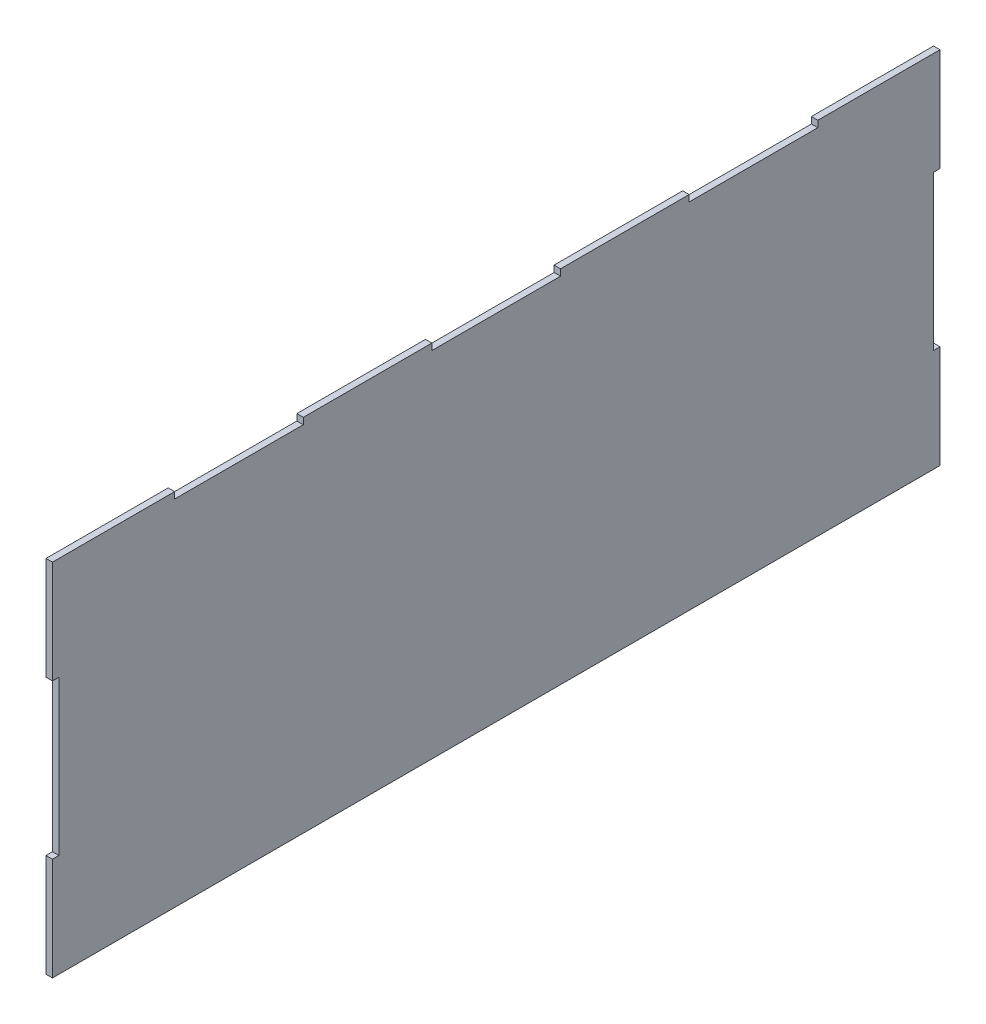
ISO-10303-21;
HEADER;
FILE_DESCRIPTION(('STEP AP214'),'2;1');
FILE_NAME('part.step','',(''),(''),'','','');
FILE_SCHEMA(('AUTOMOTIVE_DESIGN { 1 0 10303 214 1 1 1 1 }'));
ENDSEC;
DATA;
#1=APPLICATION_CONTEXT('core data for automotive mechanical design processes');
#2=APPLICATION_PROTOCOL_DEFINITION('international standard','automotive_design',2000,#1);
#3=PRODUCT_CONTEXT('',#1,'mechanical');
#4=PRODUCT('Part','Part','',(#3));
#5=PRODUCT_RELATED_PRODUCT_CATEGORY('part','',(#4));
#6=PRODUCT_DEFINITION_FORMATION('','',#4);
#7=PRODUCT_DEFINITION_CONTEXT('part definition',#1,'design');
#8=PRODUCT_DEFINITION('design','',#6,#7);
#9=PRODUCT_DEFINITION_SHAPE('','',#8);
#10=(LENGTH_UNIT() NAMED_UNIT(*) SI_UNIT(.MILLI.,.METRE.));
#11=(NAMED_UNIT(*) PLANE_ANGLE_UNIT() SI_UNIT($,.RADIAN.));
#12=(NAMED_UNIT(*) SI_UNIT($,.STERADIAN.) SOLID_ANGLE_UNIT());
#13=UNCERTAINTY_MEASURE_WITH_UNIT(LENGTH_MEASURE(1.E-05),#10,'distance_accuracy_value','');
#14=(GEOMETRIC_REPRESENTATION_CONTEXT(3) GLOBAL_UNCERTAINTY_ASSIGNED_CONTEXT((#13)) GLOBAL_UNIT_ASSIGNED_CONTEXT((#10,
#11,#12)) REPRESENTATION_CONTEXT('',''));
#15=CARTESIAN_POINT('',(0.,0.,0.));
#16=DIRECTION('',(0.,0.,1.));
#17=DIRECTION('',(1.,0.,0.));
#18=AXIS2_PLACEMENT_3D('',#15,#16,#17);
#19=CARTESIAN_POINT('',(5.,140.,340.));
#20=DIRECTION('',(0.,-1.,0.));
#21=DIRECTION('',(0.,0.,-1.));
#22=AXIS2_PLACEMENT_3D('',#19,#20,#21);
#23=PLANE('',#22);
#24=DIRECTION('',(0.,0.,1.));
#25=VECTOR('',#24,1.);
#26=CARTESIAN_POINT('',(5.,140.,340.));
#27=LINE('',#26,#25);
#28=CARTESIAN_POINT('',(5.,140.,-150.));
#29=VERTEX_POINT('',#28);
#30=CARTESIAN_POINT('',(5.,140.,-50.));
#31=VERTEX_POINT('',#30);
#32=EDGE_CURVE('E368',#29,#31,#27,.T.);
#33=ORIENTED_EDGE('',*,*,#32,.F.);
#34=DIRECTION('',(1.,0.,0.));
#35=VECTOR('',#34,1.);
#36=CARTESIAN_POINT('',(0.,140.,-150.));
#37=LINE('',#36,#35);
#38=CARTESIAN_POINT('',(0.,140.,-150.));
#39=VERTEX_POINT('',#38);
#40=EDGE_CURVE('E233',#39,#29,#37,.T.);
#41=ORIENTED_EDGE('',*,*,#40,.F.);
#42=DIRECTION('',(0.,0.,1.));
#43=VECTOR('',#42,1.);
#44=CARTESIAN_POINT('',(0.,140.,340.));
#45=LINE('',#44,#43);
#46=CARTESIAN_POINT('',(0.,140.,-50.));
#47=VERTEX_POINT('',#46);
#48=EDGE_CURVE('E223',#39,#47,#45,.T.);
#49=ORIENTED_EDGE('',*,*,#48,.T.);
#50=DIRECTION('',(1.,0.,0.));
#51=VECTOR('',#50,1.);
#52=CARTESIAN_POINT('',(0.,140.,-50.));
#53=LINE('',#52,#51);
#54=EDGE_CURVE('E283',#47,#31,#53,.T.);
#55=ORIENTED_EDGE('',*,*,#54,.T.);
#56=EDGE_LOOP('',(#33,#41,#49,#55));
#57=FACE_BOUND('',#56,.T.);
#58=ADVANCED_FACE('F39',(#57),#23,.F.);
#59=CARTESIAN_POINT('',(5.,140.,250.));
#60=VERTEX_POINT('',#59);
#61=CARTESIAN_POINT('',(5.,140.,345.));
#62=VERTEX_POINT('',#61);
#63=EDGE_CURVE('E364',#60,#62,#27,.T.);
#64=ORIENTED_EDGE('',*,*,#63,.F.);
#65=DIRECTION('',(1.,0.,0.));
#66=VECTOR('',#65,1.);
#67=CARTESIAN_POINT('',(0.,140.,250.));
#68=LINE('',#67,#66);
#69=CARTESIAN_POINT('',(0.,140.,250.));
#70=VERTEX_POINT('',#69);
#71=EDGE_CURVE('E259',#70,#60,#68,.T.);
#72=ORIENTED_EDGE('',*,*,#71,.F.);
#73=CARTESIAN_POINT('',(0.,140.,345.));
#74=VERTEX_POINT('',#73);
#75=EDGE_CURVE('E372',#70,#74,#45,.T.);
#76=ORIENTED_EDGE('',*,*,#75,.T.);
#77=DIRECTION('',(1.,0.,0.));
#78=VECTOR('',#77,1.);
#79=CARTESIAN_POINT('',(-80.156097709407,140.,345.));
#80=LINE('',#79,#78);
#81=EDGE_CURVE('E354',#74,#62,#80,.T.);
#82=ORIENTED_EDGE('',*,*,#81,.T.);
#83=EDGE_LOOP('',(#64,#72,#76,#82));
#84=FACE_BOUND('',#83,.T.);
#85=ADVANCED_FACE('F416',(#84),#23,.F.);
#86=CARTESIAN_POINT('',(0.,140.,50.));
#87=VERTEX_POINT('',#86);
#88=CARTESIAN_POINT('',(0.,140.,150.));
#89=VERTEX_POINT('',#88);
#90=EDGE_CURVE('E418',#87,#89,#45,.T.);
#91=ORIENTED_EDGE('',*,*,#90,.T.);
#92=DIRECTION('',(1.,0.,0.));
#93=VECTOR('',#92,1.);
#94=CARTESIAN_POINT('',(0.,140.,150.));
#95=LINE('',#94,#93);
#96=CARTESIAN_POINT('',(5.,140.,150.));
#97=VERTEX_POINT('',#96);
#98=EDGE_CURVE('E64',#89,#97,#95,.T.);
#99=ORIENTED_EDGE('',*,*,#98,.T.);
#100=CARTESIAN_POINT('',(5.,140.,50.));
#101=VERTEX_POINT('',#100);
#102=EDGE_CURVE('E660',#101,#97,#27,.T.);
#103=ORIENTED_EDGE('',*,*,#102,.F.);
#104=DIRECTION('',(1.,0.,0.));
#105=VECTOR('',#104,1.);
#106=CARTESIAN_POINT('',(0.,140.,50.));
#107=LINE('',#106,#105);
#108=EDGE_CURVE('E281',#87,#101,#107,.T.);
#109=ORIENTED_EDGE('',*,*,#108,.F.);
#110=EDGE_LOOP('',(#91,#99,#103,#109));
#111=FACE_BOUND('',#110,.T.);
#112=ADVANCED_FACE('F459',(#111),#23,.F.);
#113=CARTESIAN_POINT('',(5.,140.,-340.));
#114=DIRECTION('',(0.,0.,1.));
#115=DIRECTION('',(1.,0.,0.));
#116=AXIS2_PLACEMENT_3D('',#113,#114,#115);
#117=PLANE('',#116);
#118=DIRECTION('',(0.,1.,0.));
#119=VECTOR('',#118,1.);
#120=CARTESIAN_POINT('',(0.,140.,-340.));
#121=LINE('',#120,#119);
#122=CARTESIAN_POINT('',(0.,-60.,-340.));
#123=VERTEX_POINT('',#122);
#124=CARTESIAN_POINT('',(0.,60.,-340.));
#125=VERTEX_POINT('',#124);
#126=EDGE_CURVE('E348',#123,#125,#121,.T.);
#127=ORIENTED_EDGE('',*,*,#126,.T.);
#128=DIRECTION('',(1.,0.,0.));
#129=VECTOR('',#128,1.);
#130=CARTESIAN_POINT('',(-80.156097709407,60.,-340.));
#131=LINE('',#130,#129);
#132=CARTESIAN_POINT('',(5.,60.,-340.));
#133=VERTEX_POINT('',#132);
#134=EDGE_CURVE('E299',#125,#133,#131,.T.);
#135=ORIENTED_EDGE('',*,*,#134,.T.);
#136=DIRECTION('',(0.,1.,0.));
#137=VECTOR('',#136,1.);
#138=CARTESIAN_POINT('',(5.,140.,-340.));
#139=LINE('',#138,#137);
#140=CARTESIAN_POINT('',(5.,-60.,-340.));
#141=VERTEX_POINT('',#140);
#142=EDGE_CURVE('E361',#141,#133,#139,.T.);
#143=ORIENTED_EDGE('',*,*,#142,.F.);
#144=DIRECTION('',(1.,0.,0.));
#145=VECTOR('',#144,1.);
#146=CARTESIAN_POINT('',(-80.156097709407,-60.,-340.));
#147=LINE('',#146,#145);
#148=EDGE_CURVE('E308',#123,#141,#147,.T.);
#149=ORIENTED_EDGE('',*,*,#148,.F.);
#150=EDGE_LOOP('',(#127,#135,#143,#149));
#151=FACE_BOUND('',#150,.T.);
#152=ADVANCED_FACE('F41',(#151),#117,.F.);
#153=CARTESIAN_POINT('',(5.,140.,340.));
#154=DIRECTION('',(0.,0.,-1.));
#155=DIRECTION('',(-1.,0.,0.));
#156=AXIS2_PLACEMENT_3D('',#153,#154,#155);
#157=PLANE('',#156);
#158=DIRECTION('',(0.,-1.,0.));
#159=VECTOR('',#158,1.);
#160=CARTESIAN_POINT('',(0.,140.,340.));
#161=LINE('',#160,#159);
#162=CARTESIAN_POINT('',(0.,60.,340.));
#163=VERTEX_POINT('',#162);
#164=CARTESIAN_POINT('',(0.,-60.,340.));
#165=VERTEX_POINT('',#164);
#166=EDGE_CURVE('E375',#163,#165,#161,.T.);
#167=ORIENTED_EDGE('',*,*,#166,.T.);
#168=DIRECTION('',(1.,0.,0.));
#169=VECTOR('',#168,1.);
#170=CARTESIAN_POINT('',(-80.156097709407,-60.,340.));
#171=LINE('',#170,#169);
#172=CARTESIAN_POINT('',(5.,-60.,340.));
#173=VERTEX_POINT('',#172);
#174=EDGE_CURVE('E333',#165,#173,#171,.T.);
#175=ORIENTED_EDGE('',*,*,#174,.T.);
#176=DIRECTION('',(0.,-1.,0.));
#177=VECTOR('',#176,1.);
#178=CARTESIAN_POINT('',(5.,140.,340.));
#179=LINE('',#178,#177);
#180=CARTESIAN_POINT('',(5.,60.,340.));
#181=VERTEX_POINT('',#180);
#182=EDGE_CURVE('E48',#181,#173,#179,.T.);
#183=ORIENTED_EDGE('',*,*,#182,.F.);
#184=DIRECTION('',(1.,0.,0.));
#185=VECTOR('',#184,1.);
#186=CARTESIAN_POINT('',(-80.156097709407,60.,340.));
#187=LINE('',#186,#185);
#188=EDGE_CURVE('E346',#163,#181,#187,.T.);
#189=ORIENTED_EDGE('',*,*,#188,.F.);
#190=EDGE_LOOP('',(#167,#175,#183,#189));
#191=FACE_BOUND('',#190,.T.);
#192=ADVANCED_FACE('F403',(#191),#157,.F.);
#193=CARTESIAN_POINT('',(0.,140.,-345.));
#194=VERTEX_POINT('',#193);
#195=CARTESIAN_POINT('',(0.,140.,-250.));
#196=VERTEX_POINT('',#195);
#197=EDGE_CURVE('E373',#194,#196,#45,.T.);
#198=ORIENTED_EDGE('',*,*,#197,.T.);
#199=DIRECTION('',(1.,0.,0.));
#200=VECTOR('',#199,1.);
#201=CARTESIAN_POINT('',(0.,140.,-250.));
#202=LINE('',#201,#200);
#203=CARTESIAN_POINT('',(5.,140.,-250.));
#204=VERTEX_POINT('',#203);
#205=EDGE_CURVE('E236',#196,#204,#202,.T.);
#206=ORIENTED_EDGE('',*,*,#205,.T.);
#207=CARTESIAN_POINT('',(5.,140.,-345.));
#208=VERTEX_POINT('',#207);
#209=EDGE_CURVE('E365',#208,#204,#27,.T.);
#210=ORIENTED_EDGE('',*,*,#209,.F.);
#211=DIRECTION('',(1.,0.,0.));
#212=VECTOR('',#211,1.);
#213=CARTESIAN_POINT('',(-80.156097709407,140.,-345.));
#214=LINE('',#213,#212);
#215=EDGE_CURVE('E291',#194,#208,#214,.T.);
#216=ORIENTED_EDGE('',*,*,#215,.F.);
#217=EDGE_LOOP('',(#198,#206,#210,#216));
#218=FACE_BOUND('',#217,.T.);
#219=ADVANCED_FACE('F430',(#218),#23,.F.);
#220=CARTESIAN_POINT('',(5.,-140.,340.));
#221=DIRECTION('',(0.,1.,0.));
#222=DIRECTION('',(0.,0.,1.));
#223=AXIS2_PLACEMENT_3D('',#220,#221,#222);
#224=PLANE('',#223);
#225=DIRECTION('',(0.,0.,-1.));
#226=VECTOR('',#225,1.);
#227=CARTESIAN_POINT('',(0.,-140.,340.));
#228=LINE('',#227,#226);
#229=CARTESIAN_POINT('',(0.,-140.,345.));
#230=VERTEX_POINT('',#229);
#231=CARTESIAN_POINT('',(0.,-140.,-345.));
#232=VERTEX_POINT('',#231);
#233=EDGE_CURVE('E43',#230,#232,#228,.T.);
#234=ORIENTED_EDGE('',*,*,#233,.T.);
#235=DIRECTION('',(1.,0.,0.));
#236=VECTOR('',#235,1.);
#237=CARTESIAN_POINT('',(-80.156097709407,-140.,-345.));
#238=LINE('',#237,#236);
#239=CARTESIAN_POINT('',(5.,-140.,-345.));
#240=VERTEX_POINT('',#239);
#241=EDGE_CURVE('E314',#232,#240,#238,.T.);
#242=ORIENTED_EDGE('',*,*,#241,.T.);
#243=DIRECTION('',(0.,0.,-1.));
#244=VECTOR('',#243,1.);
#245=CARTESIAN_POINT('',(5.,-140.,340.));
#246=LINE('',#245,#244);
#247=CARTESIAN_POINT('',(5.,-140.,345.));
#248=VERTEX_POINT('',#247);
#249=EDGE_CURVE('E11',#248,#240,#246,.T.);
#250=ORIENTED_EDGE('',*,*,#249,.F.);
#251=DIRECTION('',(1.,0.,0.));
#252=VECTOR('',#251,1.);
#253=CARTESIAN_POINT('',(-80.156097709407,-140.,345.));
#254=LINE('',#253,#252);
#255=EDGE_CURVE('E327',#230,#248,#254,.T.);
#256=ORIENTED_EDGE('',*,*,#255,.F.);
#257=EDGE_LOOP('',(#234,#242,#250,#256));
#258=FACE_BOUND('',#257,.T.);
#259=ADVANCED_FACE('F380',(#258),#224,.F.);
#260=CARTESIAN_POINT('',(5.,0.,0.));
#261=DIRECTION('',(1.,0.,0.));
#262=DIRECTION('',(0.,0.,-1.));
#263=AXIS2_PLACEMENT_3D('',#260,#261,#262);
#264=PLANE('',#263);
#265=DIRECTION('',(0.,-1.,0.));
#266=VECTOR('',#265,1.);
#267=CARTESIAN_POINT('',(5.,135.,-150.));
#268=LINE('',#267,#266);
#269=CARTESIAN_POINT('',(5.,135.,-150.));
#270=VERTEX_POINT('',#269);
#271=EDGE_CURVE('E208',#29,#270,#268,.T.);
#272=ORIENTED_EDGE('',*,*,#271,.F.);
#273=ORIENTED_EDGE('',*,*,#32,.T.);
#274=DIRECTION('',(0.,1.,0.));
#275=VECTOR('',#274,1.);
#276=CARTESIAN_POINT('',(5.,135.,-50.));
#277=LINE('',#276,#275);
#278=CARTESIAN_POINT('',(5.,135.,-50.));
#279=VERTEX_POINT('',#278);
#280=EDGE_CURVE('E276',#279,#31,#277,.T.);
#281=ORIENTED_EDGE('',*,*,#280,.F.);
#282=DIRECTION('',(0.,0.,-1.));
#283=VECTOR('',#282,1.);
#284=CARTESIAN_POINT('',(5.,135.,-50.));
#285=LINE('',#284,#283);
#286=CARTESIAN_POINT('',(5.,135.,50.));
#287=VERTEX_POINT('',#286);
#288=EDGE_CURVE('E273',#287,#279,#285,.T.);
#289=ORIENTED_EDGE('',*,*,#288,.F.);
#290=DIRECTION('',(0.,-1.,0.));
#291=VECTOR('',#290,1.);
#292=CARTESIAN_POINT('',(5.,135.,50.));
#293=LINE('',#292,#291);
#294=EDGE_CURVE('E267',#101,#287,#293,.T.);
#295=ORIENTED_EDGE('',*,*,#294,.F.);
#296=ORIENTED_EDGE('',*,*,#102,.T.);
#297=DIRECTION('',(0.,1.,0.));
#298=VECTOR('',#297,1.);
#299=CARTESIAN_POINT('',(5.,135.,150.));
#300=LINE('',#299,#298);
#301=CARTESIAN_POINT('',(5.,135.,150.));
#302=VERTEX_POINT('',#301);
#303=EDGE_CURVE('E253',#302,#97,#300,.T.);
#304=ORIENTED_EDGE('',*,*,#303,.F.);
#305=DIRECTION('',(0.,0.,-1.));
#306=VECTOR('',#305,1.);
#307=CARTESIAN_POINT('',(5.,135.,150.));
#308=LINE('',#307,#306);
#309=CARTESIAN_POINT('',(5.,135.,250.));
#310=VERTEX_POINT('',#309);
#311=EDGE_CURVE('E250',#310,#302,#308,.T.);
#312=ORIENTED_EDGE('',*,*,#311,.F.);
#313=DIRECTION('',(0.,-1.,0.));
#314=VECTOR('',#313,1.);
#315=CARTESIAN_POINT('',(5.,135.,250.));
#316=LINE('',#315,#314);
#317=EDGE_CURVE('E244',#60,#310,#316,.T.);
#318=ORIENTED_EDGE('',*,*,#317,.F.);
#319=ORIENTED_EDGE('',*,*,#63,.T.);
#320=DIRECTION('',(0.,-1.,0.));
#321=VECTOR('',#320,1.);
#322=CARTESIAN_POINT('',(5.,140.,345.));
#323=LINE('',#322,#321);
#324=CARTESIAN_POINT('',(5.,60.,345.));
#325=VERTEX_POINT('',#324);
#326=EDGE_CURVE('E341',#62,#325,#323,.T.);
#327=ORIENTED_EDGE('',*,*,#326,.T.);
#328=DIRECTION('',(0.,0.,-1.));
#329=VECTOR('',#328,1.);
#330=CARTESIAN_POINT('',(5.,60.,340.));
#331=LINE('',#330,#329);
#332=EDGE_CURVE('E351',#325,#181,#331,.T.);
#333=ORIENTED_EDGE('',*,*,#332,.T.);
#334=ORIENTED_EDGE('',*,*,#182,.T.);
#335=DIRECTION('',(0.,0.,1.));
#336=VECTOR('',#335,1.);
#337=CARTESIAN_POINT('',(5.,-60.,340.));
#338=LINE('',#337,#336);
#339=CARTESIAN_POINT('',(5.,-60.,345.));
#340=VERTEX_POINT('',#339);
#341=EDGE_CURVE('E323',#173,#340,#338,.T.);
#342=ORIENTED_EDGE('',*,*,#341,.T.);
#343=DIRECTION('',(0.,-1.,0.));
#344=VECTOR('',#343,1.);
#345=CARTESIAN_POINT('',(5.,-140.,345.));
#346=LINE('',#345,#344);
#347=EDGE_CURVE('E330',#340,#248,#346,.T.);
#348=ORIENTED_EDGE('',*,*,#347,.T.);
#349=ORIENTED_EDGE('',*,*,#249,.T.);
#350=DIRECTION('',(0.,1.,0.));
#351=VECTOR('',#350,1.);
#352=CARTESIAN_POINT('',(5.,-140.,-345.));
#353=LINE('',#352,#351);
#354=CARTESIAN_POINT('',(5.,-60.,-345.));
#355=VERTEX_POINT('',#354);
#356=EDGE_CURVE('E293',#240,#355,#353,.T.);
#357=ORIENTED_EDGE('',*,*,#356,.T.);
#358=DIRECTION('',(0.,0.,1.));
#359=VECTOR('',#358,1.);
#360=CARTESIAN_POINT('',(5.,-60.,-340.));
#361=LINE('',#360,#359);
#362=EDGE_CURVE('E311',#355,#141,#361,.T.);
#363=ORIENTED_EDGE('',*,*,#362,.T.);
#364=ORIENTED_EDGE('',*,*,#142,.T.);
#365=DIRECTION('',(0.,0.,-1.));
#366=VECTOR('',#365,1.);
#367=CARTESIAN_POINT('',(5.,60.,-340.));
#368=LINE('',#367,#366);
#369=CARTESIAN_POINT('',(5.,60.,-345.));
#370=VERTEX_POINT('',#369);
#371=EDGE_CURVE('E235',#133,#370,#368,.T.);
#372=ORIENTED_EDGE('',*,*,#371,.T.);
#373=DIRECTION('',(0.,1.,0.));
#374=VECTOR('',#373,1.);
#375=CARTESIAN_POINT('',(5.,140.,-345.));
#376=LINE('',#375,#374);
#377=EDGE_CURVE('E296',#370,#208,#376,.T.);
#378=ORIENTED_EDGE('',*,*,#377,.T.);
#379=ORIENTED_EDGE('',*,*,#209,.T.);
#380=DIRECTION('',(0.,1.,0.));
#381=VECTOR('',#380,1.);
#382=CARTESIAN_POINT('',(5.,135.,-250.));
#383=LINE('',#382,#381);
#384=CARTESIAN_POINT('',(5.,135.,-250.));
#385=VERTEX_POINT('',#384);
#386=EDGE_CURVE('E224',#385,#204,#383,.T.);
#387=ORIENTED_EDGE('',*,*,#386,.F.);
#388=DIRECTION('',(0.,0.,-1.));
#389=VECTOR('',#388,1.);
#390=CARTESIAN_POINT('',(5.,135.,-150.));
#391=LINE('',#390,#389);
#392=EDGE_CURVE('E226',#270,#385,#391,.T.);
#393=ORIENTED_EDGE('',*,*,#392,.F.);
#394=EDGE_LOOP('',(#272,#273,#281,#289,#295,#296,#304,#312,#318,#319,#327,#333,#334,#342,#348,
#349,#357,#363,#364,#372,#378,#379,#387,#393));
#395=FACE_BOUND('',#394,.T.);
#396=ADVANCED_FACE('F392',(#395),#264,.T.);
#397=CARTESIAN_POINT('',(0.,0.,0.));
#398=DIRECTION('',(1.,0.,0.));
#399=DIRECTION('',(0.,0.,-1.));
#400=AXIS2_PLACEMENT_3D('',#397,#398,#399);
#401=PLANE('',#400);
#402=ORIENTED_EDGE('',*,*,#48,.F.);
#403=DIRECTION('',(0.,-1.,0.));
#404=VECTOR('',#403,1.);
#405=CARTESIAN_POINT('',(0.,135.,-150.));
#406=LINE('',#405,#404);
#407=CARTESIAN_POINT('',(0.,135.,-150.));
#408=VERTEX_POINT('',#407);
#409=EDGE_CURVE('E205',#39,#408,#406,.T.);
#410=ORIENTED_EDGE('',*,*,#409,.T.);
#411=DIRECTION('',(0.,0.,-1.));
#412=VECTOR('',#411,1.);
#413=CARTESIAN_POINT('',(0.,135.,-150.));
#414=LINE('',#413,#412);
#415=CARTESIAN_POINT('',(0.,135.,-250.));
#416=VERTEX_POINT('',#415);
#417=EDGE_CURVE('E215',#408,#416,#414,.T.);
#418=ORIENTED_EDGE('',*,*,#417,.T.);
#419=DIRECTION('',(0.,1.,0.));
#420=VECTOR('',#419,1.);
#421=CARTESIAN_POINT('',(0.,135.,-250.));
#422=LINE('',#421,#420);
#423=EDGE_CURVE('E56',#416,#196,#422,.T.);
#424=ORIENTED_EDGE('',*,*,#423,.T.);
#425=ORIENTED_EDGE('',*,*,#197,.F.);
#426=DIRECTION('',(0.,-1.,0.));
#427=VECTOR('',#426,1.);
#428=CARTESIAN_POINT('',(0.,140.,-345.));
#429=LINE('',#428,#427);
#430=CARTESIAN_POINT('',(0.,60.,-345.));
#431=VERTEX_POINT('',#430);
#432=EDGE_CURVE('E290',#194,#431,#429,.T.);
#433=ORIENTED_EDGE('',*,*,#432,.T.);
#434=DIRECTION('',(0.,0.,1.));
#435=VECTOR('',#434,1.);
#436=CARTESIAN_POINT('',(0.,60.,-340.));
#437=LINE('',#436,#435);
#438=EDGE_CURVE('E287',#431,#125,#437,.T.);
#439=ORIENTED_EDGE('',*,*,#438,.T.);
#440=ORIENTED_EDGE('',*,*,#126,.F.);
#441=DIRECTION('',(0.,0.,-1.));
#442=VECTOR('',#441,1.);
#443=CARTESIAN_POINT('',(0.,-60.,-340.));
#444=LINE('',#443,#442);
#445=CARTESIAN_POINT('',(0.,-60.,-345.));
#446=VERTEX_POINT('',#445);
#447=EDGE_CURVE('E305',#123,#446,#444,.T.);
#448=ORIENTED_EDGE('',*,*,#447,.T.);
#449=DIRECTION('',(0.,-1.,0.));
#450=VECTOR('',#449,1.);
#451=CARTESIAN_POINT('',(0.,-140.,-345.));
#452=LINE('',#451,#450);
#453=EDGE_CURVE('E307',#446,#232,#452,.T.);
#454=ORIENTED_EDGE('',*,*,#453,.T.);
#455=ORIENTED_EDGE('',*,*,#233,.F.);
#456=DIRECTION('',(0.,1.,0.));
#457=VECTOR('',#456,1.);
#458=CARTESIAN_POINT('',(0.,-140.,345.));
#459=LINE('',#458,#457);
#460=CARTESIAN_POINT('',(0.,-60.,345.));
#461=VERTEX_POINT('',#460);
#462=EDGE_CURVE('E324',#230,#461,#459,.T.);
#463=ORIENTED_EDGE('',*,*,#462,.T.);
#464=DIRECTION('',(0.,0.,-1.));
#465=VECTOR('',#464,1.);
#466=CARTESIAN_POINT('',(0.,-60.,340.));
#467=LINE('',#466,#465);
#468=EDGE_CURVE('E326',#461,#165,#467,.T.);
#469=ORIENTED_EDGE('',*,*,#468,.T.);
#470=ORIENTED_EDGE('',*,*,#166,.F.);
#471=DIRECTION('',(0.,0.,1.));
#472=VECTOR('',#471,1.);
#473=CARTESIAN_POINT('',(0.,60.,340.));
#474=LINE('',#473,#472);
#475=CARTESIAN_POINT('',(0.,60.,345.));
#476=VERTEX_POINT('',#475);
#477=EDGE_CURVE('E345',#163,#476,#474,.T.);
#478=ORIENTED_EDGE('',*,*,#477,.T.);
#479=DIRECTION('',(0.,1.,0.));
#480=VECTOR('',#479,1.);
#481=CARTESIAN_POINT('',(0.,140.,345.));
#482=LINE('',#481,#480);
#483=EDGE_CURVE('E342',#476,#74,#482,.T.);
#484=ORIENTED_EDGE('',*,*,#483,.T.);
#485=ORIENTED_EDGE('',*,*,#75,.F.);
#486=DIRECTION('',(0.,-1.,0.));
#487=VECTOR('',#486,1.);
#488=CARTESIAN_POINT('',(0.,135.,250.));
#489=LINE('',#488,#487);
#490=CARTESIAN_POINT('',(0.,135.,250.));
#491=VERTEX_POINT('',#490);
#492=EDGE_CURVE('E246',#70,#491,#489,.T.);
#493=ORIENTED_EDGE('',*,*,#492,.T.);
#494=DIRECTION('',(0.,0.,-1.));
#495=VECTOR('',#494,1.);
#496=CARTESIAN_POINT('',(0.,135.,150.));
#497=LINE('',#496,#495);
#498=CARTESIAN_POINT('',(0.,135.,150.));
#499=VERTEX_POINT('',#498);
#500=EDGE_CURVE('E240',#491,#499,#497,.T.);
#501=ORIENTED_EDGE('',*,*,#500,.T.);
#502=DIRECTION('',(0.,1.,0.));
#503=VECTOR('',#502,1.);
#504=CARTESIAN_POINT('',(0.,135.,150.));
#505=LINE('',#504,#503);
#506=EDGE_CURVE('E243',#499,#89,#505,.T.);
#507=ORIENTED_EDGE('',*,*,#506,.T.);
#508=ORIENTED_EDGE('',*,*,#90,.F.);
#509=DIRECTION('',(0.,-1.,0.));
#510=VECTOR('',#509,1.);
#511=CARTESIAN_POINT('',(0.,135.,50.));
#512=LINE('',#511,#510);
#513=CARTESIAN_POINT('',(0.,135.,50.));
#514=VERTEX_POINT('',#513);
#515=EDGE_CURVE('E269',#87,#514,#512,.T.);
#516=ORIENTED_EDGE('',*,*,#515,.T.);
#517=DIRECTION('',(0.,0.,-1.));
#518=VECTOR('',#517,1.);
#519=CARTESIAN_POINT('',(0.,135.,-50.));
#520=LINE('',#519,#518);
#521=CARTESIAN_POINT('',(0.,135.,-50.));
#522=VERTEX_POINT('',#521);
#523=EDGE_CURVE('E263',#514,#522,#520,.T.);
#524=ORIENTED_EDGE('',*,*,#523,.T.);
#525=DIRECTION('',(0.,1.,0.));
#526=VECTOR('',#525,1.);
#527=CARTESIAN_POINT('',(0.,135.,-50.));
#528=LINE('',#527,#526);
#529=EDGE_CURVE('E266',#522,#47,#528,.T.);
#530=ORIENTED_EDGE('',*,*,#529,.T.);
#531=EDGE_LOOP('',(#402,#410,#418,#424,#425,#433,#439,#440,#448,#454,#455,#463,#469,#470,#478,
#484,#485,#493,#501,#507,#508,#516,#524,#530));
#532=FACE_BOUND('',#531,.T.);
#533=ADVANCED_FACE('F220',(#532),#401,.F.);
#534=CARTESIAN_POINT('',(-80.156097709407,60.,340.));
#535=DIRECTION('',(0.,-1.,0.));
#536=DIRECTION('',(0.,0.,-1.));
#537=AXIS2_PLACEMENT_3D('',#534,#535,#536);
#538=PLANE('',#537);
#539=ORIENTED_EDGE('',*,*,#477,.F.);
#540=ORIENTED_EDGE('',*,*,#188,.T.);
#541=ORIENTED_EDGE('',*,*,#332,.F.);
#542=DIRECTION('',(1.,0.,0.));
#543=VECTOR('',#542,1.);
#544=CARTESIAN_POINT('',(-80.156097709407,60.,345.));
#545=LINE('',#544,#543);
#546=EDGE_CURVE('E357',#476,#325,#545,.T.);
#547=ORIENTED_EDGE('',*,*,#546,.F.);
#548=EDGE_LOOP('',(#539,#540,#541,#547));
#549=FACE_BOUND('',#548,.T.);
#550=ADVANCED_FACE('F408',(#549),#538,.T.);
#551=CARTESIAN_POINT('',(-80.156097709407,140.,345.));
#552=DIRECTION('',(0.,0.,1.));
#553=DIRECTION('',(0.,-1.,0.));
#554=AXIS2_PLACEMENT_3D('',#551,#552,#553);
#555=PLANE('',#554);
#556=ORIENTED_EDGE('',*,*,#483,.F.);
#557=ORIENTED_EDGE('',*,*,#546,.T.);
#558=ORIENTED_EDGE('',*,*,#326,.F.);
#559=ORIENTED_EDGE('',*,*,#81,.F.);
#560=EDGE_LOOP('',(#556,#557,#558,#559));
#561=FACE_BOUND('',#560,.T.);
#562=ADVANCED_FACE('F413',(#561),#555,.T.);
#563=CARTESIAN_POINT('',(-80.156097709407,-140.,345.));
#564=DIRECTION('',(0.,0.,1.));
#565=DIRECTION('',(1.,0.,0.));
#566=AXIS2_PLACEMENT_3D('',#563,#564,#565);
#567=PLANE('',#566);
#568=ORIENTED_EDGE('',*,*,#462,.F.);
#569=ORIENTED_EDGE('',*,*,#255,.T.);
#570=ORIENTED_EDGE('',*,*,#347,.F.);
#571=DIRECTION('',(1.,0.,0.));
#572=VECTOR('',#571,1.);
#573=CARTESIAN_POINT('',(-80.156097709407,-60.,345.));
#574=LINE('',#573,#572);
#575=EDGE_CURVE('E336',#461,#340,#574,.T.);
#576=ORIENTED_EDGE('',*,*,#575,.F.);
#577=EDGE_LOOP('',(#568,#569,#570,#576));
#578=FACE_BOUND('',#577,.T.);
#579=ADVANCED_FACE('F395',(#578),#567,.T.);
#580=CARTESIAN_POINT('',(-80.156097709407,-60.,340.));
#581=DIRECTION('',(0.,1.,0.));
#582=DIRECTION('',(0.,0.,1.));
#583=AXIS2_PLACEMENT_3D('',#580,#581,#582);
#584=PLANE('',#583);
#585=ORIENTED_EDGE('',*,*,#468,.F.);
#586=ORIENTED_EDGE('',*,*,#575,.T.);
#587=ORIENTED_EDGE('',*,*,#341,.F.);
#588=ORIENTED_EDGE('',*,*,#174,.F.);
#589=EDGE_LOOP('',(#585,#586,#587,#588));
#590=FACE_BOUND('',#589,.T.);
#591=ADVANCED_FACE('F402',(#590),#584,.T.);
#592=CARTESIAN_POINT('',(-80.156097709407,-60.,-340.));
#593=DIRECTION('',(0.,1.,0.));
#594=DIRECTION('',(0.,0.,1.));
#595=AXIS2_PLACEMENT_3D('',#592,#593,#594);
#596=PLANE('',#595);
#597=ORIENTED_EDGE('',*,*,#447,.F.);
#598=ORIENTED_EDGE('',*,*,#148,.T.);
#599=ORIENTED_EDGE('',*,*,#362,.F.);
#600=DIRECTION('',(1.,0.,0.));
#601=VECTOR('',#600,1.);
#602=CARTESIAN_POINT('',(-80.156097709407,-60.,-345.));
#603=LINE('',#602,#601);
#604=EDGE_CURVE('E317',#446,#355,#603,.T.);
#605=ORIENTED_EDGE('',*,*,#604,.F.);
#606=EDGE_LOOP('',(#597,#598,#599,#605));
#607=FACE_BOUND('',#606,.T.);
#608=ADVANCED_FACE('F444',(#607),#596,.T.);
#609=CARTESIAN_POINT('',(-80.156097709407,-140.,-345.));
#610=DIRECTION('',(0.,0.,-1.));
#611=DIRECTION('',(-1.,0.,0.));
#612=AXIS2_PLACEMENT_3D('',#609,#610,#611);
#613=PLANE('',#612);
#614=ORIENTED_EDGE('',*,*,#453,.F.);
#615=ORIENTED_EDGE('',*,*,#604,.T.);
#616=ORIENTED_EDGE('',*,*,#356,.F.);
#617=ORIENTED_EDGE('',*,*,#241,.F.);
#618=EDGE_LOOP('',(#614,#615,#616,#617));
#619=FACE_BOUND('',#618,.T.);
#620=ADVANCED_FACE('F389',(#619),#613,.T.);
#621=CARTESIAN_POINT('',(-80.156097709407,140.,-345.));
#622=DIRECTION('',(0.,0.,-1.));
#623=DIRECTION('',(0.,1.,0.));
#624=AXIS2_PLACEMENT_3D('',#621,#622,#623);
#625=PLANE('',#624);
#626=ORIENTED_EDGE('',*,*,#432,.F.);
#627=ORIENTED_EDGE('',*,*,#215,.T.);
#628=ORIENTED_EDGE('',*,*,#377,.F.);
#629=DIRECTION('',(1.,0.,0.));
#630=VECTOR('',#629,1.);
#631=CARTESIAN_POINT('',(-80.156097709407,60.,-345.));
#632=LINE('',#631,#630);
#633=EDGE_CURVE('E302',#431,#370,#632,.T.);
#634=ORIENTED_EDGE('',*,*,#633,.F.);
#635=EDGE_LOOP('',(#626,#627,#628,#634));
#636=FACE_BOUND('',#635,.T.);
#637=ADVANCED_FACE('F436',(#636),#625,.T.);
#638=CARTESIAN_POINT('',(-80.156097709407,60.,-340.));
#639=DIRECTION('',(0.,-1.,0.));
#640=DIRECTION('',(0.,0.,-1.));
#641=AXIS2_PLACEMENT_3D('',#638,#639,#640);
#642=PLANE('',#641);
#643=ORIENTED_EDGE('',*,*,#438,.F.);
#644=ORIENTED_EDGE('',*,*,#633,.T.);
#645=ORIENTED_EDGE('',*,*,#371,.F.);
#646=ORIENTED_EDGE('',*,*,#134,.F.);
#647=EDGE_LOOP('',(#643,#644,#645,#646));
#648=FACE_BOUND('',#647,.T.);
#649=ADVANCED_FACE('F440',(#648),#642,.T.);
#650=CARTESIAN_POINT('',(0.,135.,-50.));
#651=DIRECTION('',(0.,-1.,0.));
#652=DIRECTION('',(0.,0.,-1.));
#653=AXIS2_PLACEMENT_3D('',#650,#651,#652);
#654=PLANE('',#653);
#655=ORIENTED_EDGE('',*,*,#288,.T.);
#656=DIRECTION('',(1.,0.,0.));
#657=VECTOR('',#656,1.);
#658=CARTESIAN_POINT('',(0.,135.,-50.));
#659=LINE('',#658,#657);
#660=EDGE_CURVE('E272',#522,#279,#659,.T.);
#661=ORIENTED_EDGE('',*,*,#660,.F.);
#662=ORIENTED_EDGE('',*,*,#523,.F.);
#663=DIRECTION('',(1.,0.,0.));
#664=VECTOR('',#663,1.);
#665=CARTESIAN_POINT('',(0.,135.,50.));
#666=LINE('',#665,#664);
#667=EDGE_CURVE('E254',#514,#287,#666,.T.);
#668=ORIENTED_EDGE('',*,*,#667,.T.);
#669=EDGE_LOOP('',(#655,#661,#662,#668));
#670=FACE_BOUND('',#669,.T.);
#671=ADVANCED_FACE('F546',(#670),#654,.F.);
#672=CARTESIAN_POINT('',(0.,135.,50.));
#673=DIRECTION('',(0.,0.,1.));
#674=DIRECTION('',(1.,0.,0.));
#675=AXIS2_PLACEMENT_3D('',#672,#673,#674);
#676=PLANE('',#675);
#677=ORIENTED_EDGE('',*,*,#294,.T.);
#678=ORIENTED_EDGE('',*,*,#667,.F.);
#679=ORIENTED_EDGE('',*,*,#515,.F.);
#680=ORIENTED_EDGE('',*,*,#108,.T.);
#681=EDGE_LOOP('',(#677,#678,#679,#680));
#682=FACE_BOUND('',#681,.T.);
#683=ADVANCED_FACE('F573',(#682),#676,.F.);
#684=CARTESIAN_POINT('',(0.,135.,-50.));
#685=DIRECTION('',(0.,0.,-1.));
#686=DIRECTION('',(-1.,0.,0.));
#687=AXIS2_PLACEMENT_3D('',#684,#685,#686);
#688=PLANE('',#687);
#689=ORIENTED_EDGE('',*,*,#280,.T.);
#690=ORIENTED_EDGE('',*,*,#54,.F.);
#691=ORIENTED_EDGE('',*,*,#529,.F.);
#692=ORIENTED_EDGE('',*,*,#660,.T.);
#693=EDGE_LOOP('',(#689,#690,#691,#692));
#694=FACE_BOUND('',#693,.T.);
#695=ADVANCED_FACE('F582',(#694),#688,.F.);
#696=CARTESIAN_POINT('',(0.,135.,150.));
#697=DIRECTION('',(0.,-1.,0.));
#698=DIRECTION('',(0.,0.,-1.));
#699=AXIS2_PLACEMENT_3D('',#696,#697,#698);
#700=PLANE('',#699);
#701=ORIENTED_EDGE('',*,*,#311,.T.);
#702=DIRECTION('',(1.,0.,0.));
#703=VECTOR('',#702,1.);
#704=CARTESIAN_POINT('',(0.,135.,150.));
#705=LINE('',#704,#703);
#706=EDGE_CURVE('E249',#499,#302,#705,.T.);
#707=ORIENTED_EDGE('',*,*,#706,.F.);
#708=ORIENTED_EDGE('',*,*,#500,.F.);
#709=DIRECTION('',(1.,0.,0.));
#710=VECTOR('',#709,1.);
#711=CARTESIAN_POINT('',(0.,135.,250.));
#712=LINE('',#711,#710);
#713=EDGE_CURVE('E231',#491,#310,#712,.T.);
#714=ORIENTED_EDGE('',*,*,#713,.T.);
#715=EDGE_LOOP('',(#701,#707,#708,#714));
#716=FACE_BOUND('',#715,.T.);
#717=ADVANCED_FACE('F590',(#716),#700,.F.);
#718=CARTESIAN_POINT('',(0.,135.,250.));
#719=DIRECTION('',(0.,0.,1.));
#720=DIRECTION('',(1.,0.,0.));
#721=AXIS2_PLACEMENT_3D('',#718,#719,#720);
#722=PLANE('',#721);
#723=ORIENTED_EDGE('',*,*,#317,.T.);
#724=ORIENTED_EDGE('',*,*,#713,.F.);
#725=ORIENTED_EDGE('',*,*,#492,.F.);
#726=ORIENTED_EDGE('',*,*,#71,.T.);
#727=EDGE_LOOP('',(#723,#724,#725,#726));
#728=FACE_BOUND('',#727,.T.);
#729=ADVANCED_FACE('F598',(#728),#722,.F.);
#730=CARTESIAN_POINT('',(0.,135.,150.));
#731=DIRECTION('',(0.,0.,-1.));
#732=DIRECTION('',(-1.,0.,0.));
#733=AXIS2_PLACEMENT_3D('',#730,#731,#732);
#734=PLANE('',#733);
#735=ORIENTED_EDGE('',*,*,#303,.T.);
#736=ORIENTED_EDGE('',*,*,#98,.F.);
#737=ORIENTED_EDGE('',*,*,#506,.F.);
#738=ORIENTED_EDGE('',*,*,#706,.T.);
#739=EDGE_LOOP('',(#735,#736,#737,#738));
#740=FACE_BOUND('',#739,.T.);
#741=ADVANCED_FACE('F606',(#740),#734,.F.);
#742=CARTESIAN_POINT('',(0.,135.,-150.));
#743=DIRECTION('',(0.,0.,1.));
#744=DIRECTION('',(1.,0.,0.));
#745=AXIS2_PLACEMENT_3D('',#742,#743,#744);
#746=PLANE('',#745);
#747=ORIENTED_EDGE('',*,*,#271,.T.);
#748=DIRECTION('',(1.,0.,0.));
#749=VECTOR('',#748,1.);
#750=CARTESIAN_POINT('',(0.,135.,-150.));
#751=LINE('',#750,#749);
#752=EDGE_CURVE('E201',#408,#270,#751,.T.);
#753=ORIENTED_EDGE('',*,*,#752,.F.);
#754=ORIENTED_EDGE('',*,*,#409,.F.);
#755=ORIENTED_EDGE('',*,*,#40,.T.);
#756=EDGE_LOOP('',(#747,#753,#754,#755));
#757=FACE_BOUND('',#756,.T.);
#758=ADVANCED_FACE('F203',(#757),#746,.F.);
#759=CARTESIAN_POINT('',(0.,135.,-250.));
#760=DIRECTION('',(0.,0.,-1.));
#761=DIRECTION('',(-1.,0.,0.));
#762=AXIS2_PLACEMENT_3D('',#759,#760,#761);
#763=PLANE('',#762);
#764=ORIENTED_EDGE('',*,*,#386,.T.);
#765=ORIENTED_EDGE('',*,*,#205,.F.);
#766=ORIENTED_EDGE('',*,*,#423,.F.);
#767=DIRECTION('',(1.,0.,0.));
#768=VECTOR('',#767,1.);
#769=CARTESIAN_POINT('',(0.,135.,-250.));
#770=LINE('',#769,#768);
#771=EDGE_CURVE('E212',#416,#385,#770,.T.);
#772=ORIENTED_EDGE('',*,*,#771,.T.);
#773=EDGE_LOOP('',(#764,#765,#766,#772));
#774=FACE_BOUND('',#773,.T.);
#775=ADVANCED_FACE('F428',(#774),#763,.F.);
#776=CARTESIAN_POINT('',(0.,135.,-150.));
#777=DIRECTION('',(0.,-1.,0.));
#778=DIRECTION('',(0.,0.,-1.));
#779=AXIS2_PLACEMENT_3D('',#776,#777,#778);
#780=PLANE('',#779);
#781=ORIENTED_EDGE('',*,*,#392,.T.);
#782=ORIENTED_EDGE('',*,*,#771,.F.);
#783=ORIENTED_EDGE('',*,*,#417,.F.);
#784=ORIENTED_EDGE('',*,*,#752,.T.);
#785=EDGE_LOOP('',(#781,#782,#783,#784));
#786=FACE_BOUND('',#785,.T.);
#787=ADVANCED_FACE('F216',(#786),#780,.F.);
#788=CLOSED_SHELL('',(#58,#85,#112,#152,#192,#219,#259,#396,#533,#550,#562,#579,#591,#608,#620,
#637,#649,#671,#683,#695,#717,#729,#741,#758,#775,#787));
#789=MANIFOLD_SOLID_BREP('B2',#788);
#790=ADVANCED_BREP_SHAPE_REPRESENTATION('',(#18,#789),#14);
#791=SHAPE_DEFINITION_REPRESENTATION(#9,#790);
ENDSEC;
END-ISO-10303-21;
